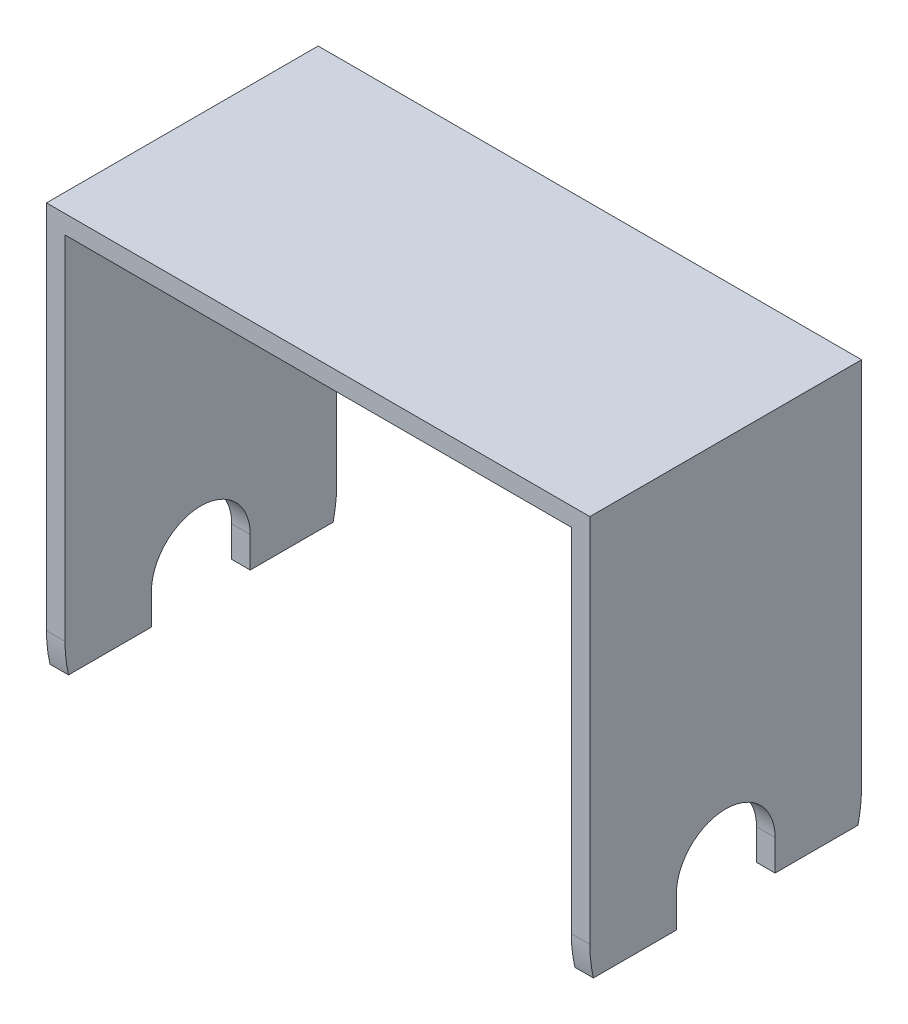
ISO-10303-21;
HEADER;
FILE_DESCRIPTION(('STEP AP214'),'2;1');
FILE_NAME('part.step','',(''),(''),'','','');
FILE_SCHEMA(('AUTOMOTIVE_DESIGN { 1 0 10303 214 1 1 1 1 }'));
ENDSEC;
DATA;
#1=APPLICATION_CONTEXT('core data for automotive mechanical design processes');
#2=APPLICATION_PROTOCOL_DEFINITION('international standard','automotive_design',2000,#1);
#3=PRODUCT_CONTEXT('',#1,'mechanical');
#4=PRODUCT('Part','Part','',(#3));
#5=PRODUCT_RELATED_PRODUCT_CATEGORY('part','',(#4));
#6=PRODUCT_DEFINITION_FORMATION('','',#4);
#7=PRODUCT_DEFINITION_CONTEXT('part definition',#1,'design');
#8=PRODUCT_DEFINITION('design','',#6,#7);
#9=PRODUCT_DEFINITION_SHAPE('','',#8);
#10=(LENGTH_UNIT() NAMED_UNIT(*) SI_UNIT(.MILLI.,.METRE.));
#11=(NAMED_UNIT(*) PLANE_ANGLE_UNIT() SI_UNIT($,.RADIAN.));
#12=(NAMED_UNIT(*) SI_UNIT($,.STERADIAN.) SOLID_ANGLE_UNIT());
#13=UNCERTAINTY_MEASURE_WITH_UNIT(LENGTH_MEASURE(1.E-05),#10,'distance_accuracy_value','');
#14=(GEOMETRIC_REPRESENTATION_CONTEXT(3) GLOBAL_UNCERTAINTY_ASSIGNED_CONTEXT((#13)) GLOBAL_UNIT_ASSIGNED_CONTEXT((#10,
#11,#12)) REPRESENTATION_CONTEXT('',''));
#15=CARTESIAN_POINT('',(0.,0.,0.));
#16=DIRECTION('',(0.,0.,1.));
#17=DIRECTION('',(1.,0.,0.));
#18=AXIS2_PLACEMENT_3D('',#15,#16,#17);
#19=CARTESIAN_POINT('',(-21.25,-2.5,-7.356071321407));
#20=DIRECTION('',(0.,-1.,0.));
#21=DIRECTION('',(0.,0.,-1.));
#22=AXIS2_PLACEMENT_3D('',#19,#20,#21);
#23=PLANE('',#22);
#24=DIRECTION('',(1.,0.,0.));
#25=VECTOR('',#24,1.);
#26=CARTESIAN_POINT('',(-22.,-2.5,4.));
#27=LINE('',#26,#25);
#28=CARTESIAN_POINT('',(-22.,-2.5,4.));
#29=VERTEX_POINT('',#28);
#30=CARTESIAN_POINT('',(-20.5,-2.5,4.));
#31=VERTEX_POINT('',#30);
#32=EDGE_CURVE('E186',#29,#31,#27,.T.);
#33=ORIENTED_EDGE('',*,*,#32,.T.);
#34=DIRECTION('',(0.,0.,-1.));
#35=VECTOR('',#34,1.);
#36=CARTESIAN_POINT('',(-20.5,-2.5,10.7121426428143));
#37=LINE('',#36,#35);
#38=CARTESIAN_POINT('',(-20.5,-2.5,10.7121426428143));
#39=VERTEX_POINT('',#38);
#40=EDGE_CURVE('E321',#39,#31,#37,.T.);
#41=ORIENTED_EDGE('',*,*,#40,.F.);
#42=DIRECTION('',(1.,0.,0.));
#43=VECTOR('',#42,1.);
#44=CARTESIAN_POINT('',(21.25,-2.5,10.7121426428143));
#45=LINE('',#44,#43);
#46=CARTESIAN_POINT('',(-22.,-2.5,10.7121426428143));
#47=VERTEX_POINT('',#46);
#48=EDGE_CURVE('E211',#47,#39,#45,.T.);
#49=ORIENTED_EDGE('',*,*,#48,.F.);
#50=DIRECTION('',(0.,0.,-1.));
#51=VECTOR('',#50,1.);
#52=CARTESIAN_POINT('',(-22.,-2.5,-7.356071321407));
#53=LINE('',#52,#51);
#54=EDGE_CURVE('E203',#47,#29,#53,.T.);
#55=ORIENTED_EDGE('',*,*,#54,.T.);
#56=EDGE_LOOP('',(#33,#41,#49,#55));
#57=FACE_BOUND('',#56,.T.);
#58=ADVANCED_FACE('F46',(#57),#23,.T.);
#59=DIRECTION('',(-1.,0.,0.));
#60=VECTOR('',#59,1.);
#61=CARTESIAN_POINT('',(22.,-2.5,-4.));
#62=LINE('',#61,#60);
#63=CARTESIAN_POINT('',(22.,-2.5,-4.));
#64=VERTEX_POINT('',#63);
#65=CARTESIAN_POINT('',(20.5,-2.5,-4.));
#66=VERTEX_POINT('',#65);
#67=EDGE_CURVE('E309',#64,#66,#62,.T.);
#68=ORIENTED_EDGE('',*,*,#67,.T.);
#69=DIRECTION('',(0.,0.,-1.));
#70=VECTOR('',#69,1.);
#71=CARTESIAN_POINT('',(20.5,-2.5,10.7121426428143));
#72=LINE('',#71,#70);
#73=CARTESIAN_POINT('',(20.5,-2.50000000000001,-10.7121426428143));
#74=VERTEX_POINT('',#73);
#75=EDGE_CURVE('E336',#66,#74,#72,.T.);
#76=ORIENTED_EDGE('',*,*,#75,.T.);
#77=DIRECTION('',(1.,0.,0.));
#78=VECTOR('',#77,1.);
#79=CARTESIAN_POINT('',(-21.25,-2.5,-10.7121426428143));
#80=LINE('',#79,#78);
#81=CARTESIAN_POINT('',(22.,-2.5,-10.7121426428143));
#82=VERTEX_POINT('',#81);
#83=EDGE_CURVE('E271',#82,#74,#80,.F.);
#84=ORIENTED_EDGE('',*,*,#83,.F.);
#85=DIRECTION('',(0.,0.,1.));
#86=VECTOR('',#85,1.);
#87=CARTESIAN_POINT('',(22.,-2.5,7.356071321407));
#88=LINE('',#87,#86);
#89=EDGE_CURVE('E239',#64,#82,#88,.F.);
#90=ORIENTED_EDGE('',*,*,#89,.F.);
#91=EDGE_LOOP('',(#68,#76,#84,#90));
#92=FACE_BOUND('',#91,.T.);
#93=ADVANCED_FACE('F424',(#92),#23,.T.);
#94=CARTESIAN_POINT('',(-21.25,0.,0.));
#95=DIRECTION('',(1.,0.,0.));
#96=DIRECTION('',(0.,0.,-1.));
#97=AXIS2_PLACEMENT_3D('',#94,#95,#96);
#98=CYLINDRICAL_SURFACE('',#97,11.);
#99=ORIENTED_EDGE('',*,*,#48,.T.);
#100=CARTESIAN_POINT('',(-20.5,0.,0.));
#101=DIRECTION('',(1.,0.,0.));
#102=DIRECTION('',(0.,0.,-1.));
#103=AXIS2_PLACEMENT_3D('',#100,#101,#102);
#104=CIRCLE('',#103,11.);
#105=CARTESIAN_POINT('',(-20.5,0.,11.));
#106=VERTEX_POINT('',#105);
#107=EDGE_CURVE('E318',#106,#39,#104,.T.);
#108=ORIENTED_EDGE('',*,*,#107,.F.);
#109=DIRECTION('',(-1.,0.,0.));
#110=VECTOR('',#109,1.);
#111=CARTESIAN_POINT('',(-21.25,0.,11.));
#112=LINE('',#111,#110);
#113=CARTESIAN_POINT('',(-22.,0.,11.));
#114=VERTEX_POINT('',#113);
#115=EDGE_CURVE('E234',#106,#114,#112,.T.);
#116=ORIENTED_EDGE('',*,*,#115,.T.);
#117=CARTESIAN_POINT('',(-22.,0.,0.));
#118=DIRECTION('',(1.,0.,0.));
#119=DIRECTION('',(0.,0.,-1.));
#120=AXIS2_PLACEMENT_3D('',#117,#118,#119);
#121=CIRCLE('',#120,11.);
#122=EDGE_CURVE('E244',#114,#47,#121,.T.);
#123=ORIENTED_EDGE('',*,*,#122,.T.);
#124=EDGE_LOOP('',(#99,#108,#116,#123));
#125=FACE_BOUND('',#124,.T.);
#126=ADVANCED_FACE('F408',(#125),#98,.T.);
#127=CARTESIAN_POINT('',(-21.25,0.,0.));
#128=DIRECTION('',(1.,0.,0.));
#129=DIRECTION('',(0.,0.,-1.));
#130=AXIS2_PLACEMENT_3D('',#127,#128,#129);
#131=CYLINDRICAL_SURFACE('',#130,11.);
#132=DIRECTION('',(-1.,0.,0.));
#133=VECTOR('',#132,1.);
#134=CARTESIAN_POINT('',(-21.25,0.,-11.));
#135=LINE('',#134,#133);
#136=CARTESIAN_POINT('',(-20.5,0.,-11.));
#137=VERTEX_POINT('',#136);
#138=CARTESIAN_POINT('',(-22.,0.,-11.));
#139=VERTEX_POINT('',#138);
#140=EDGE_CURVE('E222',#137,#139,#135,.T.);
#141=ORIENTED_EDGE('',*,*,#140,.F.);
#142=CARTESIAN_POINT('',(-20.5,0.,0.));
#143=DIRECTION('',(1.,0.,0.));
#144=DIRECTION('',(0.,0.,-1.));
#145=AXIS2_PLACEMENT_3D('',#142,#143,#144);
#146=CIRCLE('',#145,11.);
#147=CARTESIAN_POINT('',(-20.5,-2.50000000000001,-10.7121426428143));
#148=VERTEX_POINT('',#147);
#149=EDGE_CURVE('E323',#148,#137,#146,.T.);
#150=ORIENTED_EDGE('',*,*,#149,.F.);
#151=CARTESIAN_POINT('',(-22.,-2.5,-10.7121426428143));
#152=VERTEX_POINT('',#151);
#153=EDGE_CURVE('E269',#148,#152,#80,.F.);
#154=ORIENTED_EDGE('',*,*,#153,.T.);
#155=CARTESIAN_POINT('',(-22.,0.,0.));
#156=DIRECTION('',(1.,0.,0.));
#157=DIRECTION('',(0.,0.,-1.));
#158=AXIS2_PLACEMENT_3D('',#155,#156,#157);
#159=CIRCLE('',#158,11.);
#160=EDGE_CURVE('E256',#152,#139,#159,.T.);
#161=ORIENTED_EDGE('',*,*,#160,.T.);
#162=EDGE_LOOP('',(#141,#150,#154,#161));
#163=FACE_BOUND('',#162,.T.);
#164=ADVANCED_FACE('F371',(#163),#131,.T.);
#165=CARTESIAN_POINT('',(-21.25,6.75,11.));
#166=DIRECTION('',(0.,0.,-1.));
#167=DIRECTION('',(-1.,0.,0.));
#168=AXIS2_PLACEMENT_3D('',#165,#166,#167);
#169=PLANE('',#168);
#170=DIRECTION('',(0.,-1.,0.));
#171=VECTOR('',#170,1.);
#172=CARTESIAN_POINT('',(-20.5,28.5,11.));
#173=LINE('',#172,#171);
#174=CARTESIAN_POINT('',(-20.5,28.5,11.));
#175=VERTEX_POINT('',#174);
#176=EDGE_CURVE('E331',#175,#106,#173,.T.);
#177=ORIENTED_EDGE('',*,*,#176,.F.);
#178=DIRECTION('',(1.,0.,0.));
#179=VECTOR('',#178,1.);
#180=CARTESIAN_POINT('',(-20.5,28.5,11.));
#181=LINE('',#180,#179);
#182=CARTESIAN_POINT('',(20.5,28.5,11.));
#183=VERTEX_POINT('',#182);
#184=EDGE_CURVE('E253',#175,#183,#181,.T.);
#185=ORIENTED_EDGE('',*,*,#184,.T.);
#186=DIRECTION('',(0.,-1.,0.));
#187=VECTOR('',#186,1.);
#188=CARTESIAN_POINT('',(20.5,28.5,11.));
#189=LINE('',#188,#187);
#190=CARTESIAN_POINT('',(20.5,0.,11.));
#191=VERTEX_POINT('',#190);
#192=EDGE_CURVE('E295',#183,#191,#189,.T.);
#193=ORIENTED_EDGE('',*,*,#192,.T.);
#194=CARTESIAN_POINT('',(22.,0.,11.));
#195=VERTEX_POINT('',#194);
#196=EDGE_CURVE('E229',#195,#191,#112,.T.);
#197=ORIENTED_EDGE('',*,*,#196,.F.);
#198=DIRECTION('',(0.,1.,0.));
#199=VECTOR('',#198,1.);
#200=CARTESIAN_POINT('',(22.,6.75,11.));
#201=LINE('',#200,#199);
#202=CARTESIAN_POINT('',(22.,30.,11.));
#203=VERTEX_POINT('',#202);
#204=EDGE_CURVE('E230',#203,#195,#201,.F.);
#205=ORIENTED_EDGE('',*,*,#204,.F.);
#206=DIRECTION('',(1.,0.,0.));
#207=VECTOR('',#206,1.);
#208=CARTESIAN_POINT('',(-20.,30.,11.));
#209=LINE('',#208,#207);
#210=CARTESIAN_POINT('',(-22.,30.,11.));
#211=VERTEX_POINT('',#210);
#212=EDGE_CURVE('E245',#203,#211,#209,.F.);
#213=ORIENTED_EDGE('',*,*,#212,.T.);
#214=DIRECTION('',(0.,1.,0.));
#215=VECTOR('',#214,1.);
#216=CARTESIAN_POINT('',(-22.,6.75,11.));
#217=LINE('',#216,#215);
#218=EDGE_CURVE('E225',#114,#211,#217,.T.);
#219=ORIENTED_EDGE('',*,*,#218,.F.);
#220=ORIENTED_EDGE('',*,*,#115,.F.);
#221=EDGE_LOOP('',(#177,#185,#193,#197,#205,#213,#219,#220));
#222=FACE_BOUND('',#221,.T.);
#223=ADVANCED_FACE('F290',(#222),#169,.F.);
#224=DIRECTION('',(1.,0.,0.));
#225=VECTOR('',#224,1.);
#226=CARTESIAN_POINT('',(-22.,-2.5,-4.));
#227=LINE('',#226,#225);
#228=CARTESIAN_POINT('',(-22.,-2.5,-4.));
#229=VERTEX_POINT('',#228);
#230=CARTESIAN_POINT('',(-20.5,-2.5,-4.));
#231=VERTEX_POINT('',#230);
#232=EDGE_CURVE('E62',#229,#231,#227,.T.);
#233=ORIENTED_EDGE('',*,*,#232,.F.);
#234=EDGE_CURVE('E214',#229,#152,#53,.T.);
#235=ORIENTED_EDGE('',*,*,#234,.T.);
#236=ORIENTED_EDGE('',*,*,#153,.F.);
#237=EDGE_CURVE('E320',#231,#148,#37,.T.);
#238=ORIENTED_EDGE('',*,*,#237,.F.);
#239=EDGE_LOOP('',(#233,#235,#236,#238));
#240=FACE_BOUND('',#239,.T.);
#241=ADVANCED_FACE('F391',(#240),#23,.T.);
#242=CARTESIAN_POINT('',(-21.25,6.75,-11.));
#243=DIRECTION('',(0.,0.,-1.));
#244=DIRECTION('',(-1.,0.,0.));
#245=AXIS2_PLACEMENT_3D('',#242,#243,#244);
#246=PLANE('',#245);
#247=DIRECTION('',(1.,0.,0.));
#248=VECTOR('',#247,1.);
#249=CARTESIAN_POINT('',(-20.5,28.5,-11.));
#250=LINE('',#249,#248);
#251=CARTESIAN_POINT('',(-20.5,28.5,-11.));
#252=VERTEX_POINT('',#251);
#253=CARTESIAN_POINT('',(20.5,28.5,-11.));
#254=VERTEX_POINT('',#253);
#255=EDGE_CURVE('E333',#252,#254,#250,.T.);
#256=ORIENTED_EDGE('',*,*,#255,.F.);
#257=DIRECTION('',(0.,1.,0.));
#258=VECTOR('',#257,1.);
#259=CARTESIAN_POINT('',(-20.5,0.,-11.));
#260=LINE('',#259,#258);
#261=EDGE_CURVE('E325',#137,#252,#260,.T.);
#262=ORIENTED_EDGE('',*,*,#261,.F.);
#263=ORIENTED_EDGE('',*,*,#140,.T.);
#264=DIRECTION('',(0.,1.,0.));
#265=VECTOR('',#264,1.);
#266=CARTESIAN_POINT('',(-22.,6.75,-11.));
#267=LINE('',#266,#265);
#268=CARTESIAN_POINT('',(-22.,30.,-11.));
#269=VERTEX_POINT('',#268);
#270=EDGE_CURVE('E213',#139,#269,#267,.T.);
#271=ORIENTED_EDGE('',*,*,#270,.T.);
#272=DIRECTION('',(1.,0.,0.));
#273=VECTOR('',#272,1.);
#274=CARTESIAN_POINT('',(-20.,30.,-11.));
#275=LINE('',#274,#273);
#276=CARTESIAN_POINT('',(22.,30.,-11.));
#277=VERTEX_POINT('',#276);
#278=EDGE_CURVE('E250',#277,#269,#275,.F.);
#279=ORIENTED_EDGE('',*,*,#278,.F.);
#280=DIRECTION('',(0.,1.,0.));
#281=VECTOR('',#280,1.);
#282=CARTESIAN_POINT('',(22.,6.75,-11.));
#283=LINE('',#282,#281);
#284=CARTESIAN_POINT('',(22.,0.,-11.));
#285=VERTEX_POINT('',#284);
#286=EDGE_CURVE('E240',#277,#285,#283,.F.);
#287=ORIENTED_EDGE('',*,*,#286,.T.);
#288=CARTESIAN_POINT('',(20.5,0.,-11.));
#289=VERTEX_POINT('',#288);
#290=EDGE_CURVE('E350',#285,#289,#135,.T.);
#291=ORIENTED_EDGE('',*,*,#290,.T.);
#292=DIRECTION('',(0.,1.,0.));
#293=VECTOR('',#292,1.);
#294=CARTESIAN_POINT('',(20.5,0.,-11.));
#295=LINE('',#294,#293);
#296=EDGE_CURVE('E341',#289,#254,#295,.T.);
#297=ORIENTED_EDGE('',*,*,#296,.T.);
#298=EDGE_LOOP('',(#256,#262,#263,#271,#279,#287,#291,#297));
#299=FACE_BOUND('',#298,.T.);
#300=ADVANCED_FACE('F365',(#299),#246,.T.);
#301=CARTESIAN_POINT('',(22.,28.5,11.));
#302=DIRECTION('',(-1.,0.,0.));
#303=DIRECTION('',(0.,0.,1.));
#304=AXIS2_PLACEMENT_3D('',#301,#302,#303);
#305=PLANE('',#304);
#306=CARTESIAN_POINT('',(22.,0.,0.));
#307=DIRECTION('',(-1.,0.,0.));
#308=DIRECTION('',(0.,0.,1.));
#309=AXIS2_PLACEMENT_3D('',#306,#307,#308);
#310=CIRCLE('',#309,4.);
#311=CARTESIAN_POINT('',(22.,0.,4.));
#312=VERTEX_POINT('',#311);
#313=CARTESIAN_POINT('',(22.,0.,-4.));
#314=VERTEX_POINT('',#313);
#315=EDGE_CURVE('E314',#312,#314,#310,.T.);
#316=ORIENTED_EDGE('',*,*,#315,.T.);
#317=DIRECTION('',(0.,-1.,0.));
#318=VECTOR('',#317,1.);
#319=CARTESIAN_POINT('',(22.,0.,-4.));
#320=LINE('',#319,#318);
#321=EDGE_CURVE('E801',#314,#64,#320,.T.);
#322=ORIENTED_EDGE('',*,*,#321,.T.);
#323=ORIENTED_EDGE('',*,*,#89,.T.);
#324=CARTESIAN_POINT('',(22.,0.,0.));
#325=DIRECTION('',(1.,0.,0.));
#326=DIRECTION('',(0.,0.,-1.));
#327=AXIS2_PLACEMENT_3D('',#324,#325,#326);
#328=CIRCLE('',#327,11.);
#329=EDGE_CURVE('E260',#285,#82,#328,.F.);
#330=ORIENTED_EDGE('',*,*,#329,.F.);
#331=ORIENTED_EDGE('',*,*,#286,.F.);
#332=DIRECTION('',(0.,0.,-1.));
#333=VECTOR('',#332,1.);
#334=CARTESIAN_POINT('',(22.,30.,11.));
#335=LINE('',#334,#333);
#336=EDGE_CURVE('E55',#277,#203,#335,.F.);
#337=ORIENTED_EDGE('',*,*,#336,.T.);
#338=ORIENTED_EDGE('',*,*,#204,.T.);
#339=CARTESIAN_POINT('',(22.,0.,0.));
#340=DIRECTION('',(1.,0.,0.));
#341=DIRECTION('',(0.,0.,-1.));
#342=AXIS2_PLACEMENT_3D('',#339,#340,#341);
#343=CIRCLE('',#342,11.);
#344=CARTESIAN_POINT('',(22.,-2.5,10.7121426428143));
#345=VERTEX_POINT('',#344);
#346=EDGE_CURVE('E249',#345,#195,#343,.F.);
#347=ORIENTED_EDGE('',*,*,#346,.F.);
#348=CARTESIAN_POINT('',(22.,-2.5,4.));
#349=VERTEX_POINT('',#348);
#350=EDGE_CURVE('E235',#345,#349,#88,.F.);
#351=ORIENTED_EDGE('',*,*,#350,.T.);
#352=DIRECTION('',(0.,1.,0.));
#353=VECTOR('',#352,1.);
#354=CARTESIAN_POINT('',(22.,-2.5,4.));
#355=LINE('',#354,#353);
#356=EDGE_CURVE('E303',#349,#312,#355,.T.);
#357=ORIENTED_EDGE('',*,*,#356,.T.);
#358=EDGE_LOOP('',(#316,#322,#323,#330,#331,#337,#338,#347,#351,#357));
#359=FACE_BOUND('',#358,.T.);
#360=ADVANCED_FACE('F48',(#359),#305,.F.);
#361=CARTESIAN_POINT('',(20.5,0.,0.));
#362=DIRECTION('',(1.,0.,0.));
#363=DIRECTION('',(0.,0.,-1.));
#364=AXIS2_PLACEMENT_3D('',#361,#362,#363);
#365=CIRCLE('',#364,11.);
#366=CARTESIAN_POINT('',(20.5,-2.5,10.7121426428143));
#367=VERTEX_POINT('',#366);
#368=EDGE_CURVE('E334',#191,#367,#365,.T.);
#369=ORIENTED_EDGE('',*,*,#368,.T.);
#370=EDGE_CURVE('E270',#367,#345,#45,.T.);
#371=ORIENTED_EDGE('',*,*,#370,.T.);
#372=ORIENTED_EDGE('',*,*,#346,.T.);
#373=ORIENTED_EDGE('',*,*,#196,.T.);
#374=EDGE_LOOP('',(#369,#371,#372,#373));
#375=FACE_BOUND('',#374,.T.);
#376=ADVANCED_FACE('F299',(#375),#98,.T.);
#377=CARTESIAN_POINT('',(20.5,0.,0.));
#378=DIRECTION('',(1.,0.,0.));
#379=DIRECTION('',(0.,0.,-1.));
#380=AXIS2_PLACEMENT_3D('',#377,#378,#379);
#381=CIRCLE('',#380,11.);
#382=EDGE_CURVE('E338',#74,#289,#381,.T.);
#383=ORIENTED_EDGE('',*,*,#382,.T.);
#384=ORIENTED_EDGE('',*,*,#290,.F.);
#385=ORIENTED_EDGE('',*,*,#329,.T.);
#386=ORIENTED_EDGE('',*,*,#83,.T.);
#387=EDGE_LOOP('',(#383,#384,#385,#386));
#388=FACE_BOUND('',#387,.T.);
#389=ADVANCED_FACE('F410',(#388),#131,.T.);
#390=CARTESIAN_POINT('',(-22.,-15.,11.));
#391=DIRECTION('',(1.,0.,0.));
#392=DIRECTION('',(0.,0.,-1.));
#393=AXIS2_PLACEMENT_3D('',#390,#391,#392);
#394=PLANE('',#393);
#395=CARTESIAN_POINT('',(-22.,0.,0.));
#396=DIRECTION('',(1.,0.,0.));
#397=DIRECTION('',(0.,0.,-1.));
#398=AXIS2_PLACEMENT_3D('',#395,#396,#397);
#399=CIRCLE('',#398,4.);
#400=CARTESIAN_POINT('',(-22.,0.,-4.));
#401=VERTEX_POINT('',#400);
#402=CARTESIAN_POINT('',(-22.,0.,4.));
#403=VERTEX_POINT('',#402);
#404=EDGE_CURVE('E197',#401,#403,#399,.T.);
#405=ORIENTED_EDGE('',*,*,#404,.T.);
#406=DIRECTION('',(0.,-1.,0.));
#407=VECTOR('',#406,1.);
#408=CARTESIAN_POINT('',(-22.,0.,4.));
#409=LINE('',#408,#407);
#410=EDGE_CURVE('E189',#403,#29,#409,.T.);
#411=ORIENTED_EDGE('',*,*,#410,.T.);
#412=ORIENTED_EDGE('',*,*,#54,.F.);
#413=ORIENTED_EDGE('',*,*,#122,.F.);
#414=ORIENTED_EDGE('',*,*,#218,.T.);
#415=DIRECTION('',(0.,0.,-1.));
#416=VECTOR('',#415,1.);
#417=CARTESIAN_POINT('',(-22.,30.,11.));
#418=LINE('',#417,#416);
#419=EDGE_CURVE('E12',#269,#211,#418,.F.);
#420=ORIENTED_EDGE('',*,*,#419,.F.);
#421=ORIENTED_EDGE('',*,*,#270,.F.);
#422=ORIENTED_EDGE('',*,*,#160,.F.);
#423=ORIENTED_EDGE('',*,*,#234,.F.);
#424=DIRECTION('',(0.,1.,0.));
#425=VECTOR('',#424,1.);
#426=CARTESIAN_POINT('',(-22.,-2.5,-4.));
#427=LINE('',#426,#425);
#428=EDGE_CURVE('E207',#229,#401,#427,.T.);
#429=ORIENTED_EDGE('',*,*,#428,.T.);
#430=EDGE_LOOP('',(#405,#411,#412,#413,#414,#420,#421,#422,#423,#429));
#431=FACE_BOUND('',#430,.T.);
#432=ADVANCED_FACE('F201',(#431),#394,.F.);
#433=DIRECTION('',(-1.,0.,0.));
#434=VECTOR('',#433,1.);
#435=CARTESIAN_POINT('',(22.,-2.5,4.));
#436=LINE('',#435,#434);
#437=CARTESIAN_POINT('',(20.5,-2.5,4.));
#438=VERTEX_POINT('',#437);
#439=EDGE_CURVE('E70',#349,#438,#436,.T.);
#440=ORIENTED_EDGE('',*,*,#439,.F.);
#441=ORIENTED_EDGE('',*,*,#350,.F.);
#442=ORIENTED_EDGE('',*,*,#370,.F.);
#443=EDGE_CURVE('E307',#367,#438,#72,.T.);
#444=ORIENTED_EDGE('',*,*,#443,.T.);
#445=EDGE_LOOP('',(#440,#441,#442,#444));
#446=FACE_BOUND('',#445,.T.);
#447=ADVANCED_FACE('F305',(#446),#23,.T.);
#448=CARTESIAN_POINT('',(-20.5,30.,11.));
#449=DIRECTION('',(0.,-1.,0.));
#450=DIRECTION('',(0.,0.,-1.));
#451=AXIS2_PLACEMENT_3D('',#448,#449,#450);
#452=PLANE('',#451);
#453=ORIENTED_EDGE('',*,*,#212,.F.);
#454=ORIENTED_EDGE('',*,*,#336,.F.);
#455=ORIENTED_EDGE('',*,*,#278,.T.);
#456=ORIENTED_EDGE('',*,*,#419,.T.);
#457=EDGE_LOOP('',(#453,#454,#455,#456));
#458=FACE_BOUND('',#457,.T.);
#459=ADVANCED_FACE('F285',(#458),#452,.F.);
#460=CARTESIAN_POINT('',(-20.5,28.5,-11.));
#461=DIRECTION('',(0.,1.,0.));
#462=DIRECTION('',(0.,0.,1.));
#463=AXIS2_PLACEMENT_3D('',#460,#461,#462);
#464=PLANE('',#463);
#465=DIRECTION('',(0.,0.,1.));
#466=VECTOR('',#465,1.);
#467=CARTESIAN_POINT('',(20.5,28.5,-11.));
#468=LINE('',#467,#466);
#469=EDGE_CURVE('E344',#254,#183,#468,.T.);
#470=ORIENTED_EDGE('',*,*,#469,.T.);
#471=ORIENTED_EDGE('',*,*,#184,.F.);
#472=DIRECTION('',(0.,0.,1.));
#473=VECTOR('',#472,1.);
#474=CARTESIAN_POINT('',(-20.5,28.5,-11.));
#475=LINE('',#474,#473);
#476=EDGE_CURVE('E328',#252,#175,#475,.T.);
#477=ORIENTED_EDGE('',*,*,#476,.F.);
#478=ORIENTED_EDGE('',*,*,#255,.T.);
#479=EDGE_LOOP('',(#470,#471,#477,#478));
#480=FACE_BOUND('',#479,.T.);
#481=ADVANCED_FACE('F530',(#480),#464,.F.);
#482=CARTESIAN_POINT('',(-20.5,0.,0.));
#483=DIRECTION('',(1.,0.,0.));
#484=DIRECTION('',(0.,0.,-1.));
#485=AXIS2_PLACEMENT_3D('',#482,#483,#484);
#486=PLANE('',#485);
#487=DIRECTION('',(0.,-1.,0.));
#488=VECTOR('',#487,1.);
#489=CARTESIAN_POINT('',(-20.5,0.,4.));
#490=LINE('',#489,#488);
#491=CARTESIAN_POINT('',(-20.5,0.,4.));
#492=VERTEX_POINT('',#491);
#493=EDGE_CURVE('E192',#492,#31,#490,.T.);
#494=ORIENTED_EDGE('',*,*,#493,.F.);
#495=CARTESIAN_POINT('',(-20.5,0.,0.));
#496=DIRECTION('',(1.,0.,0.));
#497=DIRECTION('',(0.,0.,-1.));
#498=AXIS2_PLACEMENT_3D('',#495,#496,#497);
#499=CIRCLE('',#498,4.);
#500=CARTESIAN_POINT('',(-20.5,0.,-4.));
#501=VERTEX_POINT('',#500);
#502=EDGE_CURVE('E208',#501,#492,#499,.T.);
#503=ORIENTED_EDGE('',*,*,#502,.F.);
#504=DIRECTION('',(0.,1.,0.));
#505=VECTOR('',#504,1.);
#506=CARTESIAN_POINT('',(-20.5,-2.5,-4.));
#507=LINE('',#506,#505);
#508=EDGE_CURVE('E791',#231,#501,#507,.T.);
#509=ORIENTED_EDGE('',*,*,#508,.F.);
#510=ORIENTED_EDGE('',*,*,#237,.T.);
#511=ORIENTED_EDGE('',*,*,#149,.T.);
#512=ORIENTED_EDGE('',*,*,#261,.T.);
#513=ORIENTED_EDGE('',*,*,#476,.T.);
#514=ORIENTED_EDGE('',*,*,#176,.T.);
#515=ORIENTED_EDGE('',*,*,#107,.T.);
#516=ORIENTED_EDGE('',*,*,#40,.T.);
#517=EDGE_LOOP('',(#494,#503,#509,#510,#511,#512,#513,#514,#515,#516));
#518=FACE_BOUND('',#517,.T.);
#519=ADVANCED_FACE('F524',(#518),#486,.T.);
#520=CARTESIAN_POINT('',(20.5,0.,0.));
#521=DIRECTION('',(1.,0.,0.));
#522=DIRECTION('',(0.,0.,-1.));
#523=AXIS2_PLACEMENT_3D('',#520,#521,#522);
#524=PLANE('',#523);
#525=ORIENTED_EDGE('',*,*,#75,.F.);
#526=DIRECTION('',(0.,-1.,0.));
#527=VECTOR('',#526,1.);
#528=CARTESIAN_POINT('',(20.5,0.,-4.));
#529=LINE('',#528,#527);
#530=CARTESIAN_POINT('',(20.5,0.,-4.));
#531=VERTEX_POINT('',#530);
#532=EDGE_CURVE('E797',#531,#66,#529,.T.);
#533=ORIENTED_EDGE('',*,*,#532,.F.);
#534=CARTESIAN_POINT('',(20.5,0.,0.));
#535=DIRECTION('',(-1.,0.,0.));
#536=DIRECTION('',(0.,0.,1.));
#537=AXIS2_PLACEMENT_3D('',#534,#535,#536);
#538=CIRCLE('',#537,4.);
#539=CARTESIAN_POINT('',(20.5,0.,4.));
#540=VERTEX_POINT('',#539);
#541=EDGE_CURVE('E804',#540,#531,#538,.T.);
#542=ORIENTED_EDGE('',*,*,#541,.F.);
#543=DIRECTION('',(0.,1.,0.));
#544=VECTOR('',#543,1.);
#545=CARTESIAN_POINT('',(20.5,-2.5,4.));
#546=LINE('',#545,#544);
#547=EDGE_CURVE('E808',#438,#540,#546,.T.);
#548=ORIENTED_EDGE('',*,*,#547,.F.);
#549=ORIENTED_EDGE('',*,*,#443,.F.);
#550=ORIENTED_EDGE('',*,*,#368,.F.);
#551=ORIENTED_EDGE('',*,*,#192,.F.);
#552=ORIENTED_EDGE('',*,*,#469,.F.);
#553=ORIENTED_EDGE('',*,*,#296,.F.);
#554=ORIENTED_EDGE('',*,*,#382,.F.);
#555=EDGE_LOOP('',(#525,#533,#542,#548,#549,#550,#551,#552,#553,#554));
#556=FACE_BOUND('',#555,.T.);
#557=ADVANCED_FACE('F529',(#556),#524,.F.);
#558=CARTESIAN_POINT('',(22.,0.,-4.));
#559=DIRECTION('',(0.,0.,-1.));
#560=DIRECTION('',(-1.,0.,0.));
#561=AXIS2_PLACEMENT_3D('',#558,#559,#560);
#562=PLANE('',#561);
#563=ORIENTED_EDGE('',*,*,#532,.T.);
#564=ORIENTED_EDGE('',*,*,#67,.F.);
#565=ORIENTED_EDGE('',*,*,#321,.F.);
#566=DIRECTION('',(-1.,0.,0.));
#567=VECTOR('',#566,1.);
#568=CARTESIAN_POINT('',(22.,0.,-4.));
#569=LINE('',#568,#567);
#570=EDGE_CURVE('E311',#314,#531,#569,.T.);
#571=ORIENTED_EDGE('',*,*,#570,.T.);
#572=EDGE_LOOP('',(#563,#564,#565,#571));
#573=FACE_BOUND('',#572,.T.);
#574=ADVANCED_FACE('F567',(#573),#562,.F.);
#575=CARTESIAN_POINT('',(22.,0.,0.));
#576=DIRECTION('',(-1.,0.,0.));
#577=DIRECTION('',(0.,0.,1.));
#578=AXIS2_PLACEMENT_3D('',#575,#576,#577);
#579=CYLINDRICAL_SURFACE('',#578,4.);
#580=ORIENTED_EDGE('',*,*,#541,.T.);
#581=ORIENTED_EDGE('',*,*,#570,.F.);
#582=ORIENTED_EDGE('',*,*,#315,.F.);
#583=DIRECTION('',(-1.,0.,0.));
#584=VECTOR('',#583,1.);
#585=CARTESIAN_POINT('',(22.,0.,4.));
#586=LINE('',#585,#584);
#587=EDGE_CURVE('E308',#312,#540,#586,.T.);
#588=ORIENTED_EDGE('',*,*,#587,.T.);
#589=EDGE_LOOP('',(#580,#581,#582,#588));
#590=FACE_BOUND('',#589,.T.);
#591=ADVANCED_FACE('F564',(#590),#579,.F.);
#592=CARTESIAN_POINT('',(22.,-2.5,4.));
#593=DIRECTION('',(0.,0.,1.));
#594=DIRECTION('',(1.,0.,0.));
#595=AXIS2_PLACEMENT_3D('',#592,#593,#594);
#596=PLANE('',#595);
#597=ORIENTED_EDGE('',*,*,#547,.T.);
#598=ORIENTED_EDGE('',*,*,#587,.F.);
#599=ORIENTED_EDGE('',*,*,#356,.F.);
#600=ORIENTED_EDGE('',*,*,#439,.T.);
#601=EDGE_LOOP('',(#597,#598,#599,#600));
#602=FACE_BOUND('',#601,.T.);
#603=ADVANCED_FACE('F498',(#602),#596,.F.);
#604=CARTESIAN_POINT('',(-22.,0.,4.));
#605=DIRECTION('',(0.,0.,1.));
#606=DIRECTION('',(1.,0.,0.));
#607=AXIS2_PLACEMENT_3D('',#604,#605,#606);
#608=PLANE('',#607);
#609=ORIENTED_EDGE('',*,*,#493,.T.);
#610=ORIENTED_EDGE('',*,*,#32,.F.);
#611=ORIENTED_EDGE('',*,*,#410,.F.);
#612=DIRECTION('',(1.,0.,0.));
#613=VECTOR('',#612,1.);
#614=CARTESIAN_POINT('',(-22.,0.,4.));
#615=LINE('',#614,#613);
#616=EDGE_CURVE('E795',#403,#492,#615,.T.);
#617=ORIENTED_EDGE('',*,*,#616,.T.);
#618=EDGE_LOOP('',(#609,#610,#611,#617));
#619=FACE_BOUND('',#618,.T.);
#620=ADVANCED_FACE('F188',(#619),#608,.F.);
#621=CARTESIAN_POINT('',(-22.,0.,0.));
#622=DIRECTION('',(1.,0.,0.));
#623=DIRECTION('',(0.,0.,-1.));
#624=AXIS2_PLACEMENT_3D('',#621,#622,#623);
#625=CYLINDRICAL_SURFACE('',#624,4.);
#626=ORIENTED_EDGE('',*,*,#502,.T.);
#627=ORIENTED_EDGE('',*,*,#616,.F.);
#628=ORIENTED_EDGE('',*,*,#404,.F.);
#629=DIRECTION('',(1.,0.,0.));
#630=VECTOR('',#629,1.);
#631=CARTESIAN_POINT('',(-22.,0.,-4.));
#632=LINE('',#631,#630);
#633=EDGE_CURVE('E798',#401,#501,#632,.T.);
#634=ORIENTED_EDGE('',*,*,#633,.T.);
#635=EDGE_LOOP('',(#626,#627,#628,#634));
#636=FACE_BOUND('',#635,.T.);
#637=ADVANCED_FACE('F541',(#636),#625,.F.);
#638=CARTESIAN_POINT('',(-22.,-2.5,-4.));
#639=DIRECTION('',(0.,0.,-1.));
#640=DIRECTION('',(-1.,0.,0.));
#641=AXIS2_PLACEMENT_3D('',#638,#639,#640);
#642=PLANE('',#641);
#643=ORIENTED_EDGE('',*,*,#508,.T.);
#644=ORIENTED_EDGE('',*,*,#633,.F.);
#645=ORIENTED_EDGE('',*,*,#428,.F.);
#646=ORIENTED_EDGE('',*,*,#232,.T.);
#647=EDGE_LOOP('',(#643,#644,#645,#646));
#648=FACE_BOUND('',#647,.T.);
#649=ADVANCED_FACE('F550',(#648),#642,.F.);
#650=CLOSED_SHELL('',(#58,#93,#126,#164,#223,#241,#300,#360,#376,#389,#432,#447,#459,#481,#519,
#557,#574,#591,#603,#620,#637,#649));
#651=MANIFOLD_SOLID_BREP('B2',#650);
#652=ADVANCED_BREP_SHAPE_REPRESENTATION('',(#18,#651),#14);
#653=SHAPE_DEFINITION_REPRESENTATION(#9,#652);
ENDSEC;
END-ISO-10303-21;
